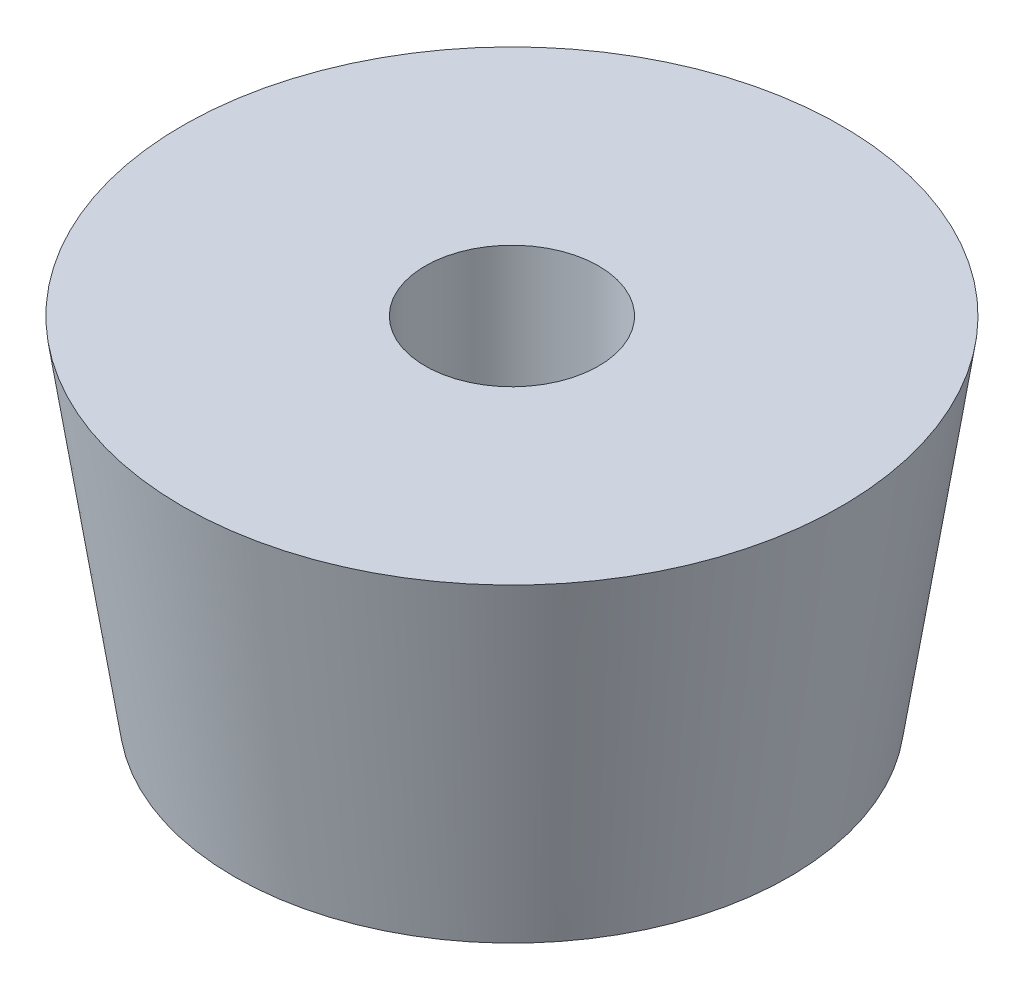
ISO-10303-21;
HEADER;
FILE_DESCRIPTION(('STEP AP214'),'2;1');
FILE_NAME('part.step','',(''),(''),'','','');
FILE_SCHEMA(('AUTOMOTIVE_DESIGN { 1 0 10303 214 1 1 1 1 }'));
ENDSEC;
DATA;
#1=APPLICATION_CONTEXT('core data for automotive mechanical design processes');
#2=APPLICATION_PROTOCOL_DEFINITION('international standard','automotive_design',2000,#1);
#3=PRODUCT_CONTEXT('',#1,'mechanical');
#4=PRODUCT('Part','Part','',(#3));
#5=PRODUCT_RELATED_PRODUCT_CATEGORY('part','',(#4));
#6=PRODUCT_DEFINITION_FORMATION('','',#4);
#7=PRODUCT_DEFINITION_CONTEXT('part definition',#1,'design');
#8=PRODUCT_DEFINITION('design','',#6,#7);
#9=PRODUCT_DEFINITION_SHAPE('','',#8);
#10=(LENGTH_UNIT() NAMED_UNIT(*) SI_UNIT(.MILLI.,.METRE.));
#11=(NAMED_UNIT(*) PLANE_ANGLE_UNIT() SI_UNIT($,.RADIAN.));
#12=(NAMED_UNIT(*) SI_UNIT($,.STERADIAN.) SOLID_ANGLE_UNIT());
#13=UNCERTAINTY_MEASURE_WITH_UNIT(LENGTH_MEASURE(1.E-05),#10,'distance_accuracy_value','');
#14=(GEOMETRIC_REPRESENTATION_CONTEXT(3) GLOBAL_UNCERTAINTY_ASSIGNED_CONTEXT((#13)) GLOBAL_UNIT_ASSIGNED_CONTEXT((#10,
#11,#12)) REPRESENTATION_CONTEXT('',''));
#15=CARTESIAN_POINT('',(0.,0.,0.));
#16=DIRECTION('',(0.,0.,1.));
#17=DIRECTION('',(1.,0.,0.));
#18=AXIS2_PLACEMENT_3D('',#15,#16,#17);
#19=CARTESIAN_POINT('',(2.5,5.,0.));
#20=DIRECTION('',(0.,-1.,0.));
#21=DIRECTION('',(0.,0.,-1.));
#22=AXIS2_PLACEMENT_3D('',#19,#20,#21);
#23=PLANE('',#22);
#24=CARTESIAN_POINT('',(0.,5.,0.));
#25=DIRECTION('',(0.,-1.,0.));
#26=DIRECTION('',(0.,0.,-1.));
#27=AXIS2_PLACEMENT_3D('',#24,#25,#26);
#28=CIRCLE('',#27,2.5);
#29=CARTESIAN_POINT('',(0.,5.,-2.5));
#30=VERTEX_POINT('',#29);
#31=EDGE_CURVE('E34',#30,#30,#28,.F.);
#32=ORIENTED_EDGE('',*,*,#31,.T.);
#33=EDGE_LOOP('',(#32));
#34=FACE_BOUND('',#33,.T.);
#35=CARTESIAN_POINT('',(0.,5.,0.));
#36=DIRECTION('',(0.,-1.,0.));
#37=DIRECTION('',(0.,0.,-1.));
#38=AXIS2_PLACEMENT_3D('',#35,#36,#37);
#39=CIRCLE('',#38,4.5);
#40=CARTESIAN_POINT('',(0.,5.,-4.5));
#41=VERTEX_POINT('',#40);
#42=EDGE_CURVE('E18',#41,#41,#39,.T.);
#43=ORIENTED_EDGE('',*,*,#42,.T.);
#44=EDGE_LOOP('',(#43));
#45=FACE_BOUND('',#44,.T.);
#46=ADVANCED_FACE('F15',(#34,#45),#23,.T.);
#47=CARTESIAN_POINT('',(0.,0.,0.));
#48=DIRECTION('',(0.,-1.,0.));
#49=DIRECTION('',(0.,0.,-1.));
#50=AXIS2_PLACEMENT_3D('',#47,#48,#49);
#51=CYLINDRICAL_SURFACE('',#50,4.5);
#52=CARTESIAN_POINT('',(0.,0.,0.));
#53=DIRECTION('',(0.,-1.,0.));
#54=DIRECTION('',(0.,0.,-1.));
#55=AXIS2_PLACEMENT_3D('',#52,#53,#54);
#56=CIRCLE('',#55,4.5);
#57=CARTESIAN_POINT('',(0.,0.,-4.5));
#58=VERTEX_POINT('',#57);
#59=EDGE_CURVE('E32',#58,#58,#56,.F.);
#60=ORIENTED_EDGE('',*,*,#59,.F.);
#61=EDGE_LOOP('',(#60));
#62=FACE_BOUND('',#61,.T.);
#63=ORIENTED_EDGE('',*,*,#42,.F.);
#64=EDGE_LOOP('',(#63));
#65=FACE_BOUND('',#64,.T.);
#66=ADVANCED_FACE('F42',(#62,#65),#51,.F.);
#67=CARTESIAN_POINT('',(0.,0.,0.));
#68=DIRECTION('',(0.,-1.,0.));
#69=DIRECTION('',(0.,0.,-1.));
#70=AXIS2_PLACEMENT_3D('',#67,#68,#69);
#71=CYLINDRICAL_SURFACE('',#70,2.5);
#72=ORIENTED_EDGE('',*,*,#31,.F.);
#73=EDGE_LOOP('',(#72));
#74=FACE_BOUND('',#73,.T.);
#75=CARTESIAN_POINT('',(0.,10.,0.));
#76=DIRECTION('',(0.,-1.,0.));
#77=DIRECTION('',(0.,0.,-1.));
#78=AXIS2_PLACEMENT_3D('',#75,#76,#77);
#79=CIRCLE('',#78,2.5);
#80=CARTESIAN_POINT('',(0.,10.,-2.5));
#81=VERTEX_POINT('',#80);
#82=EDGE_CURVE('E27',#81,#81,#79,.T.);
#83=ORIENTED_EDGE('',*,*,#82,.F.);
#84=EDGE_LOOP('',(#83));
#85=FACE_BOUND('',#84,.T.);
#86=ADVANCED_FACE('F44',(#74,#85),#71,.F.);
#87=CARTESIAN_POINT('',(4.5,0.,0.));
#88=DIRECTION('',(0.,-1.,0.));
#89=DIRECTION('',(0.,0.,-1.));
#90=AXIS2_PLACEMENT_3D('',#87,#88,#89);
#91=PLANE('',#90);
#92=ORIENTED_EDGE('',*,*,#59,.T.);
#93=EDGE_LOOP('',(#92));
#94=FACE_BOUND('',#93,.T.);
#95=CARTESIAN_POINT('',(0.,0.,0.));
#96=DIRECTION('',(0.,1.,0.));
#97=DIRECTION('',(0.,0.,1.));
#98=AXIS2_PLACEMENT_3D('',#95,#96,#97);
#99=CIRCLE('',#98,8.);
#100=CARTESIAN_POINT('',(0.,0.,8.));
#101=VERTEX_POINT('',#100);
#102=EDGE_CURVE('E22',#101,#101,#99,.T.);
#103=ORIENTED_EDGE('',*,*,#102,.F.);
#104=EDGE_LOOP('',(#103));
#105=FACE_BOUND('',#104,.T.);
#106=ADVANCED_FACE('F51',(#94,#105),#91,.T.);
#107=CARTESIAN_POINT('',(9.5,10.,0.));
#108=DIRECTION('',(0.,1.,0.));
#109=DIRECTION('',(0.,0.,1.));
#110=AXIS2_PLACEMENT_3D('',#107,#108,#109);
#111=PLANE('',#110);
#112=CARTESIAN_POINT('',(0.,9.99999999999999,0.));
#113=DIRECTION('',(0.,1.,0.));
#114=DIRECTION('',(0.,0.,1.));
#115=AXIS2_PLACEMENT_3D('',#112,#113,#114);
#116=CIRCLE('',#115,9.5);
#117=CARTESIAN_POINT('',(0.,9.99999999999999,9.5));
#118=VERTEX_POINT('',#117);
#119=EDGE_CURVE('E10',#118,#118,#116,.F.);
#120=ORIENTED_EDGE('',*,*,#119,.F.);
#121=EDGE_LOOP('',(#120));
#122=FACE_BOUND('',#121,.T.);
#123=ORIENTED_EDGE('',*,*,#82,.T.);
#124=EDGE_LOOP('',(#123));
#125=FACE_BOUND('',#124,.T.);
#126=ADVANCED_FACE('F57',(#122,#125),#111,.T.);
#127=CARTESIAN_POINT('',(0.,10.,0.));
#128=DIRECTION('',(0.,1.,0.));
#129=DIRECTION('',(0.,0.,1.));
#130=AXIS2_PLACEMENT_3D('',#127,#128,#129);
#131=CONICAL_SURFACE('',#130,9.5,0.148889947609497);
#132=ORIENTED_EDGE('',*,*,#119,.T.);
#133=EDGE_LOOP('',(#132));
#134=FACE_BOUND('',#133,.T.);
#135=ORIENTED_EDGE('',*,*,#102,.T.);
#136=EDGE_LOOP('',(#135));
#137=FACE_BOUND('',#136,.T.);
#138=ADVANCED_FACE('F55',(#134,#137),#131,.T.);
#139=CLOSED_SHELL('',(#46,#66,#86,#106,#126,#138));
#140=MANIFOLD_SOLID_BREP('B1',#139);
#141=ADVANCED_BREP_SHAPE_REPRESENTATION('',(#18,#140),#14);
#142=SHAPE_DEFINITION_REPRESENTATION(#9,#141);
ENDSEC;
END-ISO-10303-21;
